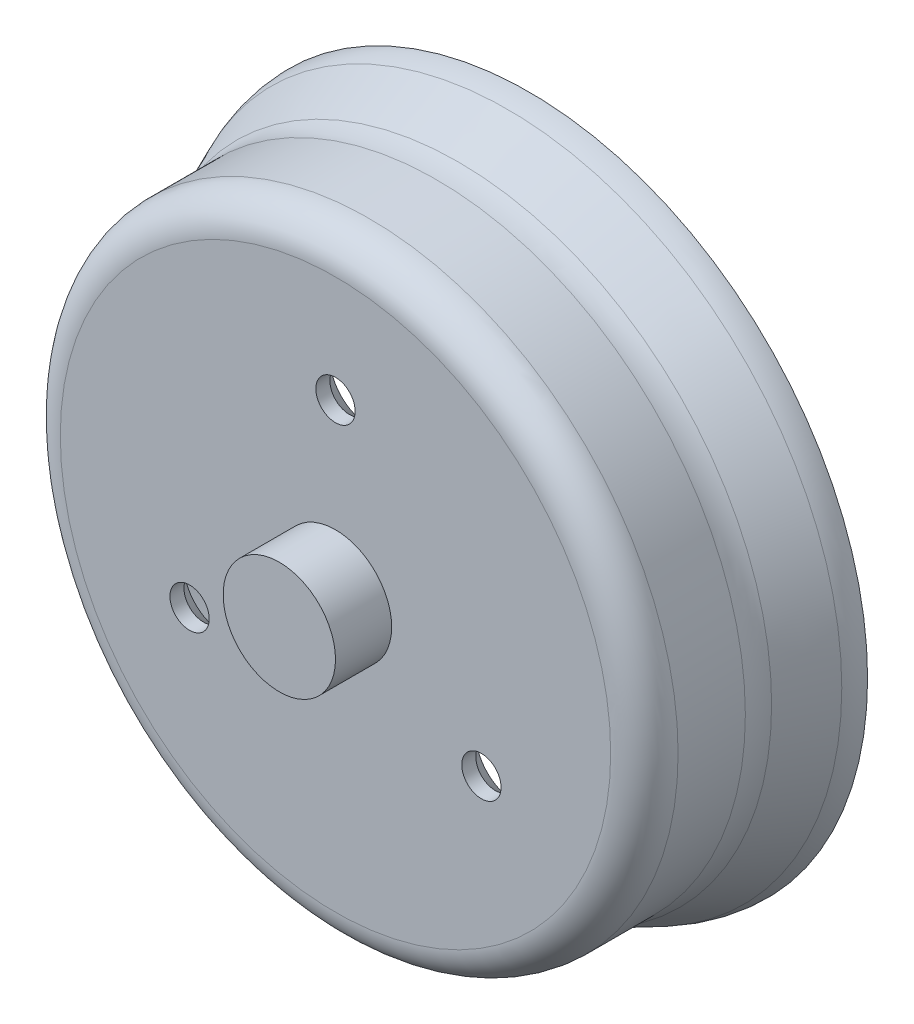
ISO-10303-21;
HEADER;
FILE_DESCRIPTION(('STEP AP214'),'2;1');
FILE_NAME('part.step','',(''),(''),'','','');
FILE_SCHEMA(('AUTOMOTIVE_DESIGN { 1 0 10303 214 1 1 1 1 }'));
ENDSEC;
DATA;
#1=APPLICATION_CONTEXT('core data for automotive mechanical design processes');
#2=APPLICATION_PROTOCOL_DEFINITION('international standard','automotive_design',2000,#1);
#3=PRODUCT_CONTEXT('',#1,'mechanical');
#4=PRODUCT('Part','Part','',(#3));
#5=PRODUCT_RELATED_PRODUCT_CATEGORY('part','',(#4));
#6=PRODUCT_DEFINITION_FORMATION('','',#4);
#7=PRODUCT_DEFINITION_CONTEXT('part definition',#1,'design');
#8=PRODUCT_DEFINITION('design','',#6,#7);
#9=PRODUCT_DEFINITION_SHAPE('','',#8);
#10=(LENGTH_UNIT() NAMED_UNIT(*) SI_UNIT(.MILLI.,.METRE.));
#11=(NAMED_UNIT(*) PLANE_ANGLE_UNIT() SI_UNIT($,.RADIAN.));
#12=(NAMED_UNIT(*) SI_UNIT($,.STERADIAN.) SOLID_ANGLE_UNIT());
#13=UNCERTAINTY_MEASURE_WITH_UNIT(LENGTH_MEASURE(1.E-05),#10,'distance_accuracy_value','');
#14=(GEOMETRIC_REPRESENTATION_CONTEXT(3) GLOBAL_UNCERTAINTY_ASSIGNED_CONTEXT((#13)) GLOBAL_UNIT_ASSIGNED_CONTEXT((#10,
#11,#12)) REPRESENTATION_CONTEXT('',''));
#15=CARTESIAN_POINT('',(0.,0.,0.));
#16=DIRECTION('',(0.,0.,1.));
#17=DIRECTION('',(1.,0.,0.));
#18=AXIS2_PLACEMENT_3D('',#15,#16,#17);
#19=CARTESIAN_POINT('',(0.,0.,10.));
#20=DIRECTION('',(0.,0.,-1.));
#21=DIRECTION('',(-1.,0.,0.));
#22=AXIS2_PLACEMENT_3D('',#19,#20,#21);
#23=CYLINDRICAL_SURFACE('',#22,25.5);
#24=CARTESIAN_POINT('',(0.,0.,1.01205432015929));
#25=DIRECTION('',(0.,0.,-1.));
#26=DIRECTION('',(-1.,0.,0.));
#27=AXIS2_PLACEMENT_3D('',#24,#25,#26);
#28=CIRCLE('',#27,25.5);
#29=CARTESIAN_POINT('',(-25.5,0.,1.01205432015929));
#30=VERTEX_POINT('',#29);
#31=EDGE_CURVE('E67',#30,#30,#28,.T.);
#32=ORIENTED_EDGE('',*,*,#31,.T.);
#33=EDGE_LOOP('',(#32));
#34=FACE_BOUND('',#33,.T.);
#35=CARTESIAN_POINT('',(0.,0.,7.));
#36=DIRECTION('',(0.,0.,1.));
#37=DIRECTION('',(1.,0.,0.));
#38=AXIS2_PLACEMENT_3D('',#35,#36,#37);
#39=CIRCLE('',#38,25.5);
#40=CARTESIAN_POINT('',(25.5,0.,7.));
#41=VERTEX_POINT('',#40);
#42=EDGE_CURVE('E107',#41,#41,#39,.T.);
#43=ORIENTED_EDGE('',*,*,#42,.T.);
#44=EDGE_LOOP('',(#43));
#45=FACE_BOUND('',#44,.T.);
#46=ADVANCED_FACE('F39',(#34,#45),#23,.F.);
#47=CARTESIAN_POINT('',(0.,0.,10.));
#48=DIRECTION('',(0.,0.,1.));
#49=DIRECTION('',(1.,0.,0.));
#50=AXIS2_PLACEMENT_3D('',#47,#48,#49);
#51=PLANE('',#50);
#52=CARTESIAN_POINT('',(0.,15.,10.));
#53=DIRECTION('',(0.,0.,1.));
#54=DIRECTION('',(1.,0.,0.));
#55=AXIS2_PLACEMENT_3D('',#52,#53,#54);
#56=CIRCLE('',#55,1.75);
#57=CARTESIAN_POINT('',(1.75,15.,10.));
#58=VERTEX_POINT('',#57);
#59=EDGE_CURVE('E116',#58,#58,#56,.T.);
#60=ORIENTED_EDGE('',*,*,#59,.F.);
#61=EDGE_LOOP('',(#60));
#62=FACE_BOUND('',#61,.T.);
#63=CARTESIAN_POINT('',(12.9903810567675,-7.49999999999945,10.));
#64=DIRECTION('',(0.,0.,1.));
#65=DIRECTION('',(1.,0.,0.));
#66=AXIS2_PLACEMENT_3D('',#63,#64,#65);
#67=CIRCLE('',#66,1.75);
#68=CARTESIAN_POINT('',(14.7403810567675,-7.49999999999945,10.));
#69=VERTEX_POINT('',#68);
#70=EDGE_CURVE('E124',#69,#69,#67,.T.);
#71=ORIENTED_EDGE('',*,*,#70,.F.);
#72=EDGE_LOOP('',(#71));
#73=FACE_BOUND('',#72,.T.);
#74=CARTESIAN_POINT('',(-12.9903810567656,-7.50000000000056,10.));
#75=DIRECTION('',(0.,0.,1.));
#76=DIRECTION('',(1.,0.,0.));
#77=AXIS2_PLACEMENT_3D('',#74,#75,#76);
#78=CIRCLE('',#77,1.75);
#79=CARTESIAN_POINT('',(-11.2403810567656,-7.50000000000056,10.));
#80=VERTEX_POINT('',#79);
#81=EDGE_CURVE('E120',#80,#80,#78,.T.);
#82=ORIENTED_EDGE('',*,*,#81,.F.);
#83=EDGE_LOOP('',(#82));
#84=FACE_BOUND('',#83,.T.);
#85=CARTESIAN_POINT('',(0.,0.,10.));
#86=DIRECTION('',(0.,0.,1.));
#87=DIRECTION('',(1.,0.,0.));
#88=AXIS2_PLACEMENT_3D('',#85,#86,#87);
#89=CIRCLE('',#88,5.);
#90=CARTESIAN_POINT('',(5.,0.,10.));
#91=VERTEX_POINT('',#90);
#92=EDGE_CURVE('E112',#91,#91,#89,.T.);
#93=ORIENTED_EDGE('',*,*,#92,.F.);
#94=EDGE_LOOP('',(#93));
#95=FACE_BOUND('',#94,.T.);
#96=CARTESIAN_POINT('',(0.,0.,10.));
#97=DIRECTION('',(0.,0.,1.));
#98=DIRECTION('',(1.,0.,0.));
#99=AXIS2_PLACEMENT_3D('',#96,#97,#98);
#100=CIRCLE('',#99,24.5);
#101=CARTESIAN_POINT('',(24.5,0.,10.));
#102=VERTEX_POINT('',#101);
#103=EDGE_CURVE('E103',#102,#102,#100,.T.);
#104=ORIENTED_EDGE('',*,*,#103,.T.);
#105=EDGE_LOOP('',(#104));
#106=FACE_BOUND('',#105,.T.);
#107=ADVANCED_FACE('F134',(#62,#73,#84,#95,#106),#51,.T.);
#108=CARTESIAN_POINT('',(0.,0.,10.));
#109=DIRECTION('',(0.,0.,-1.));
#110=DIRECTION('',(-1.,0.,0.));
#111=AXIS2_PLACEMENT_3D('',#108,#109,#110);
#112=CYLINDRICAL_SURFACE('',#111,27.5);
#113=CARTESIAN_POINT('',(0.,0.,1.01205432015928));
#114=DIRECTION('',(0.,0.,1.));
#115=DIRECTION('',(1.,0.,0.));
#116=AXIS2_PLACEMENT_3D('',#113,#114,#115);
#117=CIRCLE('',#116,27.5);
#118=CARTESIAN_POINT('',(27.5,0.,1.01205432015928));
#119=VERTEX_POINT('',#118);
#120=EDGE_CURVE('E10',#119,#119,#117,.T.);
#121=ORIENTED_EDGE('',*,*,#120,.T.);
#122=EDGE_LOOP('',(#121));
#123=FACE_BOUND('',#122,.T.);
#124=CARTESIAN_POINT('',(0.,0.,7.));
#125=DIRECTION('',(0.,0.,1.));
#126=DIRECTION('',(1.,0.,0.));
#127=AXIS2_PLACEMENT_3D('',#124,#125,#126);
#128=CIRCLE('',#127,27.5);
#129=CARTESIAN_POINT('',(27.5,0.,7.));
#130=VERTEX_POINT('',#129);
#131=EDGE_CURVE('E99',#130,#130,#128,.F.);
#132=ORIENTED_EDGE('',*,*,#131,.T.);
#133=EDGE_LOOP('',(#132));
#134=FACE_BOUND('',#133,.T.);
#135=ADVANCED_FACE('F137',(#123,#134),#112,.T.);
#136=CARTESIAN_POINT('',(0.,0.,7.));
#137=DIRECTION('',(0.,0.,1.));
#138=DIRECTION('',(1.,0.,0.));
#139=AXIS2_PLACEMENT_3D('',#136,#137,#138);
#140=PLANE('',#139);
#141=CARTESIAN_POINT('',(12.9903810567675,-7.49999999999945,7.));
#142=DIRECTION('',(0.,0.,1.));
#143=DIRECTION('',(1.,0.,0.));
#144=AXIS2_PLACEMENT_3D('',#141,#142,#143);
#145=CIRCLE('',#144,3.50000000000001);
#146=CARTESIAN_POINT('',(16.4903810567675,-7.49999999999945,7.));
#147=VERTEX_POINT('',#146);
#148=EDGE_CURVE('E87',#147,#147,#145,.T.);
#149=ORIENTED_EDGE('',*,*,#148,.T.);
#150=EDGE_LOOP('',(#149));
#151=FACE_BOUND('',#150,.T.);
#152=CARTESIAN_POINT('',(-12.9903810567656,-7.50000000000056,7.));
#153=DIRECTION('',(0.,0.,1.));
#154=DIRECTION('',(1.,0.,0.));
#155=AXIS2_PLACEMENT_3D('',#152,#153,#154);
#156=CIRCLE('',#155,3.50000000000001);
#157=CARTESIAN_POINT('',(-9.49038105676561,-7.50000000000056,7.));
#158=VERTEX_POINT('',#157);
#159=EDGE_CURVE('E91',#158,#158,#156,.T.);
#160=ORIENTED_EDGE('',*,*,#159,.T.);
#161=EDGE_LOOP('',(#160));
#162=FACE_BOUND('',#161,.T.);
#163=CARTESIAN_POINT('',(0.,15.,7.));
#164=DIRECTION('',(0.,0.,1.));
#165=DIRECTION('',(1.,0.,0.));
#166=AXIS2_PLACEMENT_3D('',#163,#164,#165);
#167=CIRCLE('',#166,3.5);
#168=CARTESIAN_POINT('',(3.5,15.,7.));
#169=VERTEX_POINT('',#168);
#170=EDGE_CURVE('E95',#169,#169,#167,.T.);
#171=ORIENTED_EDGE('',*,*,#170,.T.);
#172=EDGE_LOOP('',(#171));
#173=FACE_BOUND('',#172,.T.);
#174=ORIENTED_EDGE('',*,*,#42,.F.);
#175=EDGE_LOOP('',(#174));
#176=FACE_BOUND('',#175,.T.);
#177=ADVANCED_FACE('F150',(#151,#162,#173,#176),#140,.F.);
#178=CARTESIAN_POINT('',(0.,0.,7.));
#179=DIRECTION('',(0.,0.,1.));
#180=DIRECTION('',(1.,0.,0.));
#181=AXIS2_PLACEMENT_3D('',#178,#179,#180);
#182=TOROIDAL_SURFACE('',#181,24.5,3.);
#183=ORIENTED_EDGE('',*,*,#131,.F.);
#184=EDGE_LOOP('',(#183));
#185=FACE_BOUND('',#184,.T.);
#186=ORIENTED_EDGE('',*,*,#103,.F.);
#187=EDGE_LOOP('',(#186));
#188=FACE_BOUND('',#187,.T.);
#189=ADVANCED_FACE('F147',(#185,#188),#182,.T.);
#190=CARTESIAN_POINT('',(0.,0.,15.));
#191=DIRECTION('',(0.,0.,-1.));
#192=DIRECTION('',(-1.,0.,0.));
#193=AXIS2_PLACEMENT_3D('',#190,#191,#192);
#194=CYLINDRICAL_SURFACE('',#193,5.);
#195=CARTESIAN_POINT('',(0.,0.,15.));
#196=DIRECTION('',(0.,0.,1.));
#197=DIRECTION('',(1.,0.,0.));
#198=AXIS2_PLACEMENT_3D('',#195,#196,#197);
#199=CIRCLE('',#198,5.);
#200=CARTESIAN_POINT('',(5.,0.,15.));
#201=VERTEX_POINT('',#200);
#202=EDGE_CURVE('E111',#201,#201,#199,.T.);
#203=ORIENTED_EDGE('',*,*,#202,.F.);
#204=EDGE_LOOP('',(#203));
#205=FACE_BOUND('',#204,.T.);
#206=ORIENTED_EDGE('',*,*,#92,.T.);
#207=EDGE_LOOP('',(#206));
#208=FACE_BOUND('',#207,.T.);
#209=ADVANCED_FACE('F149',(#205,#208),#194,.T.);
#210=CARTESIAN_POINT('',(0.,0.,15.));
#211=DIRECTION('',(0.,0.,1.));
#212=DIRECTION('',(1.,0.,0.));
#213=AXIS2_PLACEMENT_3D('',#210,#211,#212);
#214=PLANE('',#213);
#215=ORIENTED_EDGE('',*,*,#202,.T.);
#216=EDGE_LOOP('',(#215));
#217=FACE_BOUND('',#216,.T.);
#218=ADVANCED_FACE('F157',(#217),#214,.T.);
#219=CARTESIAN_POINT('',(-12.9903810567656,-7.50000000000056,0.));
#220=DIRECTION('',(0.,0.,1.));
#221=DIRECTION('',(1.,0.,0.));
#222=AXIS2_PLACEMENT_3D('',#219,#220,#221);
#223=CYLINDRICAL_SURFACE('',#222,1.75);
#224=CARTESIAN_POINT('',(-12.9903810567656,-7.50000000000056,8.75000000000002));
#225=DIRECTION('',(0.,0.,1.));
#226=DIRECTION('',(1.,0.,0.));
#227=AXIS2_PLACEMENT_3D('',#224,#225,#226);
#228=CIRCLE('',#227,1.75);
#229=CARTESIAN_POINT('',(-11.2403810567656,-7.50000000000056,8.75000000000002));
#230=VERTEX_POINT('',#229);
#231=EDGE_CURVE('E79',#230,#230,#228,.F.);
#232=ORIENTED_EDGE('',*,*,#231,.T.);
#233=EDGE_LOOP('',(#232));
#234=FACE_BOUND('',#233,.T.);
#235=ORIENTED_EDGE('',*,*,#81,.T.);
#236=EDGE_LOOP('',(#235));
#237=FACE_BOUND('',#236,.T.);
#238=ADVANCED_FACE('F192',(#234,#237),#223,.F.);
#239=CARTESIAN_POINT('',(12.9903810567675,-7.49999999999945,0.));
#240=DIRECTION('',(0.,0.,1.));
#241=DIRECTION('',(1.,0.,0.));
#242=AXIS2_PLACEMENT_3D('',#239,#240,#241);
#243=CYLINDRICAL_SURFACE('',#242,1.75);
#244=CARTESIAN_POINT('',(12.9903810567675,-7.49999999999945,8.75000000000002));
#245=DIRECTION('',(0.,0.,1.));
#246=DIRECTION('',(1.,0.,0.));
#247=AXIS2_PLACEMENT_3D('',#244,#245,#246);
#248=CIRCLE('',#247,1.75);
#249=CARTESIAN_POINT('',(14.7403810567675,-7.49999999999945,8.75000000000002));
#250=VERTEX_POINT('',#249);
#251=EDGE_CURVE('E83',#250,#250,#248,.F.);
#252=ORIENTED_EDGE('',*,*,#251,.T.);
#253=EDGE_LOOP('',(#252));
#254=FACE_BOUND('',#253,.T.);
#255=ORIENTED_EDGE('',*,*,#70,.T.);
#256=EDGE_LOOP('',(#255));
#257=FACE_BOUND('',#256,.T.);
#258=ADVANCED_FACE('F197',(#254,#257),#243,.F.);
#259=CARTESIAN_POINT('',(0.,15.,0.));
#260=DIRECTION('',(0.,0.,1.));
#261=DIRECTION('',(1.,0.,0.));
#262=AXIS2_PLACEMENT_3D('',#259,#260,#261);
#263=CYLINDRICAL_SURFACE('',#262,1.75);
#264=CARTESIAN_POINT('',(0.,15.,8.75000000000001));
#265=DIRECTION('',(0.,0.,1.));
#266=DIRECTION('',(1.,0.,0.));
#267=AXIS2_PLACEMENT_3D('',#264,#265,#266);
#268=CIRCLE('',#267,1.75);
#269=CARTESIAN_POINT('',(1.75,15.,8.75000000000001));
#270=VERTEX_POINT('',#269);
#271=EDGE_CURVE('E75',#270,#270,#268,.F.);
#272=ORIENTED_EDGE('',*,*,#271,.T.);
#273=EDGE_LOOP('',(#272));
#274=FACE_BOUND('',#273,.T.);
#275=ORIENTED_EDGE('',*,*,#59,.T.);
#276=EDGE_LOOP('',(#275));
#277=FACE_BOUND('',#276,.T.);
#278=ADVANCED_FACE('F132',(#274,#277),#263,.F.);
#279=CARTESIAN_POINT('',(12.9903810567675,-7.49999999999945,7.));
#280=DIRECTION('',(0.,0.,-1.));
#281=DIRECTION('',(-1.,0.,0.));
#282=AXIS2_PLACEMENT_3D('',#279,#280,#281);
#283=CONICAL_SURFACE('',#282,3.50000000000001,0.785398163397445);
#284=ORIENTED_EDGE('',*,*,#251,.F.);
#285=EDGE_LOOP('',(#284));
#286=FACE_BOUND('',#285,.T.);
#287=ORIENTED_EDGE('',*,*,#148,.F.);
#288=EDGE_LOOP('',(#287));
#289=FACE_BOUND('',#288,.T.);
#290=ADVANCED_FACE('F218',(#286,#289),#283,.F.);
#291=CARTESIAN_POINT('',(-12.9903810567656,-7.50000000000056,7.));
#292=DIRECTION('',(0.,0.,-1.));
#293=DIRECTION('',(-1.,0.,0.));
#294=AXIS2_PLACEMENT_3D('',#291,#292,#293);
#295=CONICAL_SURFACE('',#294,3.50000000000001,0.785398163397445);
#296=ORIENTED_EDGE('',*,*,#231,.F.);
#297=EDGE_LOOP('',(#296));
#298=FACE_BOUND('',#297,.T.);
#299=ORIENTED_EDGE('',*,*,#159,.F.);
#300=EDGE_LOOP('',(#299));
#301=FACE_BOUND('',#300,.T.);
#302=ADVANCED_FACE('F228',(#298,#301),#295,.F.);
#303=CARTESIAN_POINT('',(0.,15.,7.));
#304=DIRECTION('',(0.,0.,-1.));
#305=DIRECTION('',(-1.,0.,0.));
#306=AXIS2_PLACEMENT_3D('',#303,#304,#305);
#307=CONICAL_SURFACE('',#306,3.5,0.785398163397446);
#308=ORIENTED_EDGE('',*,*,#271,.F.);
#309=EDGE_LOOP('',(#308));
#310=FACE_BOUND('',#309,.T.);
#311=ORIENTED_EDGE('',*,*,#170,.F.);
#312=EDGE_LOOP('',(#311));
#313=FACE_BOUND('',#312,.T.);
#314=ADVANCED_FACE('F237',(#310,#313),#307,.F.);
#315=CARTESIAN_POINT('',(0.,0.,0.));
#316=DIRECTION('',(0.,0.,-1.));
#317=DIRECTION('',(-1.,0.,0.));
#318=AXIS2_PLACEMENT_3D('',#315,#316,#317);
#319=CONICAL_SURFACE('',#318,27.5,0.399425239880595);
#320=CARTESIAN_POINT('',(0.,0.,-5.32439492608145));
#321=DIRECTION('',(0.,0.,-1.));
#322=DIRECTION('',(-1.,0.,0.));
#323=AXIS2_PLACEMENT_3D('',#320,#321,#322);
#324=CIRCLE('',#323,29.7475116625162);
#325=CARTESIAN_POINT('',(-29.7475116625162,0.,-5.32439492608145));
#326=VERTEX_POINT('',#325);
#327=EDGE_CURVE('E47',#326,#326,#324,.F.);
#328=ORIENTED_EDGE('',*,*,#327,.T.);
#329=EDGE_LOOP('',(#328));
#330=FACE_BOUND('',#329,.T.);
#331=CARTESIAN_POINT('',(0.,0.,-0.932390124285171));
#332=DIRECTION('',(0.,0.,1.));
#333=DIRECTION('',(1.,0.,0.));
#334=AXIS2_PLACEMENT_3D('',#331,#332,#333);
#335=CIRCLE('',#334,27.8935766800619);
#336=CARTESIAN_POINT('',(27.8935766800619,0.,-0.932390124285171));
#337=VERTEX_POINT('',#336);
#338=EDGE_CURVE('E52',#337,#337,#335,.F.);
#339=ORIENTED_EDGE('',*,*,#338,.T.);
#340=EDGE_LOOP('',(#339));
#341=FACE_BOUND('',#340,.T.);
#342=ADVANCED_FACE('F246',(#330,#341),#319,.T.);
#343=CARTESIAN_POINT('',(0.,0.,-8.2915619758885));
#344=DIRECTION('',(0.,0.,-1.));
#345=DIRECTION('',(-1.,0.,0.));
#346=AXIS2_PLACEMENT_3D('',#343,#344,#345);
#347=CONICAL_SURFACE('',#346,29.,0.399425239880595);
#348=CARTESIAN_POINT('',(0.,0.,-4.54094963476322));
#349=DIRECTION('',(0.,0.,1.));
#350=DIRECTION('',(1.,0.,0.));
#351=AXIS2_PLACEMENT_3D('',#348,#349,#350);
#352=CIRCLE('',#351,27.4168069620523);
#353=CARTESIAN_POINT('',(27.4168069620523,0.,-4.54094963476322));
#354=VERTEX_POINT('',#353);
#355=EDGE_CURVE('E63',#354,#354,#352,.F.);
#356=ORIENTED_EDGE('',*,*,#355,.T.);
#357=EDGE_LOOP('',(#356));
#358=FACE_BOUND('',#357,.T.);
#359=CARTESIAN_POINT('',(0.,0.,-0.932390124285164));
#360=DIRECTION('',(0.,0.,1.));
#361=DIRECTION('',(1.,0.,0.));
#362=AXIS2_PLACEMENT_3D('',#359,#360,#361);
#363=CIRCLE('',#362,25.893576680062);
#364=CARTESIAN_POINT('',(25.893576680062,0.,-0.932390124285164));
#365=VERTEX_POINT('',#364);
#366=EDGE_CURVE('E71',#365,#365,#363,.T.);
#367=ORIENTED_EDGE('',*,*,#366,.T.);
#368=EDGE_LOOP('',(#367));
#369=FACE_BOUND('',#368,.T.);
#370=ADVANCED_FACE('F265',(#358,#369),#347,.F.);
#371=CARTESIAN_POINT('',(0.,0.,1.01205432015929));
#372=DIRECTION('',(0.,0.,-1.));
#373=DIRECTION('',(-1.,0.,0.));
#374=AXIS2_PLACEMENT_3D('',#371,#372,#373);
#375=TOROIDAL_SURFACE('',#374,30.5,5.);
#376=ORIENTED_EDGE('',*,*,#31,.F.);
#377=EDGE_LOOP('',(#376));
#378=FACE_BOUND('',#377,.T.);
#379=ORIENTED_EDGE('',*,*,#366,.F.);
#380=EDGE_LOOP('',(#379));
#381=FACE_BOUND('',#380,.T.);
#382=ADVANCED_FACE('F259',(#378,#381),#375,.T.);
#383=CARTESIAN_POINT('',(0.,0.,-2.59650519031875));
#384=DIRECTION('',(0.,0.,1.));
#385=DIRECTION('',(1.,0.,0.));
#386=AXIS2_PLACEMENT_3D('',#383,#384,#385);
#387=TOROIDAL_SURFACE('',#386,32.0232302819904,5.);
#388=CARTESIAN_POINT('',(0.,0.,-7.22866820916999));
#389=DIRECTION('',(0.,0.,1.));
#390=DIRECTION('',(1.,0.,0.));
#391=AXIS2_PLACEMENT_3D('',#388,#389,#390);
#392=CIRCLE('',#391,30.1409269677535);
#393=CARTESIAN_POINT('',(30.1409269677535,0.,-7.22866820916999));
#394=VERTEX_POINT('',#393);
#395=EDGE_CURVE('E57',#394,#394,#392,.T.);
#396=ORIENTED_EDGE('',*,*,#395,.F.);
#397=EDGE_LOOP('',(#396));
#398=FACE_BOUND('',#397,.T.);
#399=ORIENTED_EDGE('',*,*,#355,.F.);
#400=EDGE_LOOP('',(#399));
#401=FACE_BOUND('',#400,.T.);
#402=ADVANCED_FACE('F264',(#398,#401),#387,.T.);
#403=CARTESIAN_POINT('',(0.,0.,-7.2688393705259));
#404=DIRECTION('',(0.,0.,-1.));
#405=DIRECTION('',(-1.,0.,0.));
#406=AXIS2_PLACEMENT_3D('',#403,#404,#405);
#407=TOROIDAL_SURFACE('',#406,25.1410883425781,5.);
#408=ORIENTED_EDGE('',*,*,#395,.T.);
#409=EDGE_LOOP('',(#408));
#410=FACE_BOUND('',#409,.T.);
#411=ORIENTED_EDGE('',*,*,#327,.F.);
#412=EDGE_LOOP('',(#411));
#413=FACE_BOUND('',#412,.T.);
#414=ADVANCED_FACE('F282',(#410,#413),#407,.T.);
#415=CARTESIAN_POINT('',(0.,0.,1.01205432015928));
#416=DIRECTION('',(0.,0.,1.));
#417=DIRECTION('',(1.,0.,0.));
#418=AXIS2_PLACEMENT_3D('',#415,#416,#417);
#419=TOROIDAL_SURFACE('',#418,32.5,5.);
#420=ORIENTED_EDGE('',*,*,#338,.F.);
#421=EDGE_LOOP('',(#420));
#422=FACE_BOUND('',#421,.T.);
#423=ORIENTED_EDGE('',*,*,#120,.F.);
#424=EDGE_LOOP('',(#423));
#425=FACE_BOUND('',#424,.T.);
#426=ADVANCED_FACE('F41',(#422,#425),#419,.F.);
#427=CLOSED_SHELL('',(#46,#107,#135,#177,#189,#209,#218,#238,#258,#278,#290,#302,#314,#342,#370,
#382,#402,#414,#426));
#428=MANIFOLD_SOLID_BREP('B2',#427);
#429=ADVANCED_BREP_SHAPE_REPRESENTATION('',(#18,#428),#14);
#430=SHAPE_DEFINITION_REPRESENTATION(#9,#429);
ENDSEC;
END-ISO-10303-21;
